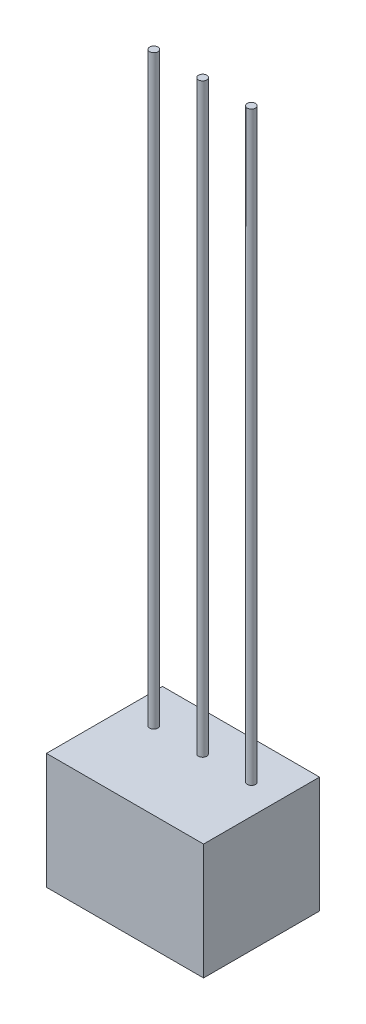
ISO-10303-21;
HEADER;
FILE_DESCRIPTION(('STEP AP214'),'2;1');
FILE_NAME('part.step','',(''),(''),'','','');
FILE_SCHEMA(('AUTOMOTIVE_DESIGN { 1 0 10303 214 1 1 1 1 }'));
ENDSEC;
DATA;
#1=APPLICATION_CONTEXT('core data for automotive mechanical design processes');
#2=APPLICATION_PROTOCOL_DEFINITION('international standard','automotive_design',2000,#1);
#3=PRODUCT_CONTEXT('',#1,'mechanical');
#4=PRODUCT('Part','Part','',(#3));
#5=PRODUCT_RELATED_PRODUCT_CATEGORY('part','',(#4));
#6=PRODUCT_DEFINITION_FORMATION('','',#4);
#7=PRODUCT_DEFINITION_CONTEXT('part definition',#1,'design');
#8=PRODUCT_DEFINITION('design','',#6,#7);
#9=PRODUCT_DEFINITION_SHAPE('','',#8);
#10=(LENGTH_UNIT() NAMED_UNIT(*) SI_UNIT(.MILLI.,.METRE.));
#11=(NAMED_UNIT(*) PLANE_ANGLE_UNIT() SI_UNIT($,.RADIAN.));
#12=(NAMED_UNIT(*) SI_UNIT($,.STERADIAN.) SOLID_ANGLE_UNIT());
#13=UNCERTAINTY_MEASURE_WITH_UNIT(LENGTH_MEASURE(1.E-05),#10,'distance_accuracy_value','');
#14=(GEOMETRIC_REPRESENTATION_CONTEXT(3) GLOBAL_UNCERTAINTY_ASSIGNED_CONTEXT((#13)) GLOBAL_UNIT_ASSIGNED_CONTEXT((#10,
#11,#12)) REPRESENTATION_CONTEXT('',''));
#15=CARTESIAN_POINT('',(0.,0.,0.));
#16=DIRECTION('',(0.,0.,1.));
#17=DIRECTION('',(1.,0.,0.));
#18=AXIS2_PLACEMENT_3D('',#15,#16,#17);
#19=CARTESIAN_POINT('',(0.,3.02,3.02));
#20=DIRECTION('',(0.,1.,0.));
#21=DIRECTION('',(0.,0.,1.));
#22=AXIS2_PLACEMENT_3D('',#19,#20,#21);
#23=PLANE('',#22);
#24=CARTESIAN_POINT('',(2.045,3.02,1.));
#25=DIRECTION('',(0.,1.,0.));
#26=DIRECTION('',(0.,0.,1.));
#27=AXIS2_PLACEMENT_3D('',#24,#25,#26);
#28=CIRCLE('',#27,0.107499999999999);
#29=CARTESIAN_POINT('',(2.045,3.02,1.1075));
#30=VERTEX_POINT('',#29);
#31=EDGE_CURVE('E155',#30,#30,#28,.T.);
#32=ORIENTED_EDGE('',*,*,#31,.F.);
#33=EDGE_LOOP('',(#32));
#34=FACE_BOUND('',#33,.T.);
#35=DIRECTION('',(1.,0.,0.));
#36=VECTOR('',#35,1.);
#37=CARTESIAN_POINT('',(0.,3.02,0.));
#38=LINE('',#37,#36);
#39=CARTESIAN_POINT('',(0.,3.02,0.));
#40=VERTEX_POINT('',#39);
#41=CARTESIAN_POINT('',(4.09,3.02,0.));
#42=VERTEX_POINT('',#41);
#43=EDGE_CURVE('E102',#40,#42,#38,.T.);
#44=ORIENTED_EDGE('',*,*,#43,.F.);
#45=DIRECTION('',(0.,0.,-1.));
#46=VECTOR('',#45,1.);
#47=CARTESIAN_POINT('',(0.,3.02,3.02));
#48=LINE('',#47,#46);
#49=CARTESIAN_POINT('',(0.,3.02,3.02));
#50=VERTEX_POINT('',#49);
#51=EDGE_CURVE('E36',#50,#40,#48,.T.);
#52=ORIENTED_EDGE('',*,*,#51,.F.);
#53=DIRECTION('',(1.,0.,0.));
#54=VECTOR('',#53,1.);
#55=CARTESIAN_POINT('',(0.,3.02,3.02));
#56=LINE('',#55,#54);
#57=CARTESIAN_POINT('',(4.09,3.02,3.02));
#58=VERTEX_POINT('',#57);
#59=EDGE_CURVE('E82',#50,#58,#56,.T.);
#60=ORIENTED_EDGE('',*,*,#59,.T.);
#61=DIRECTION('',(0.,0.,-1.));
#62=VECTOR('',#61,1.);
#63=CARTESIAN_POINT('',(4.09,3.02,3.02));
#64=LINE('',#63,#62);
#65=EDGE_CURVE('E87',#58,#42,#64,.T.);
#66=ORIENTED_EDGE('',*,*,#65,.T.);
#67=EDGE_LOOP('',(#44,#52,#60,#66));
#68=FACE_BOUND('',#67,.T.);
#69=CARTESIAN_POINT('',(0.774999999999998,3.02,1.));
#70=DIRECTION('',(0.,1.,0.));
#71=DIRECTION('',(0.,0.,1.));
#72=AXIS2_PLACEMENT_3D('',#69,#70,#71);
#73=CIRCLE('',#72,0.107499999999999);
#74=CARTESIAN_POINT('',(0.774999999999998,3.02,1.1075));
#75=VERTEX_POINT('',#74);
#76=EDGE_CURVE('E165',#75,#75,#73,.T.);
#77=ORIENTED_EDGE('',*,*,#76,.F.);
#78=EDGE_LOOP('',(#77));
#79=FACE_BOUND('',#78,.T.);
#80=CARTESIAN_POINT('',(3.315,3.02,1.));
#81=DIRECTION('',(0.,1.,0.));
#82=DIRECTION('',(0.,0.,1.));
#83=AXIS2_PLACEMENT_3D('',#80,#81,#82);
#84=CIRCLE('',#83,0.107499999999995);
#85=CARTESIAN_POINT('',(3.315,3.02,1.1075));
#86=VERTEX_POINT('',#85);
#87=EDGE_CURVE('E156',#86,#86,#84,.T.);
#88=ORIENTED_EDGE('',*,*,#87,.F.);
#89=EDGE_LOOP('',(#88));
#90=FACE_BOUND('',#89,.T.);
#91=ADVANCED_FACE('F32',(#34,#68,#79,#90),#23,.T.);
#92=CARTESIAN_POINT('',(0.,0.,3.02));
#93=DIRECTION('',(-1.,0.,0.));
#94=DIRECTION('',(0.,0.,1.));
#95=AXIS2_PLACEMENT_3D('',#92,#93,#94);
#96=PLANE('',#95);
#97=DIRECTION('',(0.,1.,0.));
#98=VECTOR('',#97,1.);
#99=CARTESIAN_POINT('',(0.,0.,0.));
#100=LINE('',#99,#98);
#101=CARTESIAN_POINT('',(0.,0.,0.));
#102=VERTEX_POINT('',#101);
#103=EDGE_CURVE('E99',#102,#40,#100,.T.);
#104=ORIENTED_EDGE('',*,*,#103,.F.);
#105=DIRECTION('',(0.,0.,-1.));
#106=VECTOR('',#105,1.);
#107=CARTESIAN_POINT('',(0.,0.,3.02));
#108=LINE('',#107,#106);
#109=CARTESIAN_POINT('',(0.,0.,3.02));
#110=VERTEX_POINT('',#109);
#111=EDGE_CURVE('E11',#110,#102,#108,.T.);
#112=ORIENTED_EDGE('',*,*,#111,.F.);
#113=DIRECTION('',(0.,1.,0.));
#114=VECTOR('',#113,1.);
#115=CARTESIAN_POINT('',(0.,0.,3.02));
#116=LINE('',#115,#114);
#117=EDGE_CURVE('E93',#110,#50,#116,.T.);
#118=ORIENTED_EDGE('',*,*,#117,.T.);
#119=ORIENTED_EDGE('',*,*,#51,.T.);
#120=EDGE_LOOP('',(#104,#112,#118,#119));
#121=FACE_BOUND('',#120,.T.);
#122=ADVANCED_FACE('F34',(#121),#96,.T.);
#123=CARTESIAN_POINT('',(0.,0.,3.02));
#124=DIRECTION('',(0.,1.,0.));
#125=DIRECTION('',(0.,0.,1.));
#126=AXIS2_PLACEMENT_3D('',#123,#124,#125);
#127=PLANE('',#126);
#128=DIRECTION('',(1.,0.,0.));
#129=VECTOR('',#128,1.);
#130=CARTESIAN_POINT('',(0.,0.,0.));
#131=LINE('',#130,#129);
#132=CARTESIAN_POINT('',(4.09,0.,0.));
#133=VERTEX_POINT('',#132);
#134=EDGE_CURVE('E66',#102,#133,#131,.T.);
#135=ORIENTED_EDGE('',*,*,#134,.T.);
#136=DIRECTION('',(0.,0.,-1.));
#137=VECTOR('',#136,1.);
#138=CARTESIAN_POINT('',(4.09,0.,3.02));
#139=LINE('',#138,#137);
#140=CARTESIAN_POINT('',(4.09,0.,3.02));
#141=VERTEX_POINT('',#140);
#142=EDGE_CURVE('E42',#141,#133,#139,.T.);
#143=ORIENTED_EDGE('',*,*,#142,.F.);
#144=DIRECTION('',(1.,0.,0.));
#145=VECTOR('',#144,1.);
#146=CARTESIAN_POINT('',(0.,0.,3.02));
#147=LINE('',#146,#145);
#148=EDGE_CURVE('E83',#110,#141,#147,.T.);
#149=ORIENTED_EDGE('',*,*,#148,.F.);
#150=ORIENTED_EDGE('',*,*,#111,.T.);
#151=EDGE_LOOP('',(#135,#143,#149,#150));
#152=FACE_BOUND('',#151,.T.);
#153=ADVANCED_FACE('F110',(#152),#127,.F.);
#154=CARTESIAN_POINT('',(4.09,0.,3.02));
#155=DIRECTION('',(-1.,0.,0.));
#156=DIRECTION('',(0.,0.,1.));
#157=AXIS2_PLACEMENT_3D('',#154,#155,#156);
#158=PLANE('',#157);
#159=DIRECTION('',(0.,1.,0.));
#160=VECTOR('',#159,1.);
#161=CARTESIAN_POINT('',(4.09,0.,0.));
#162=LINE('',#161,#160);
#163=EDGE_CURVE('E90',#133,#42,#162,.T.);
#164=ORIENTED_EDGE('',*,*,#163,.T.);
#165=ORIENTED_EDGE('',*,*,#65,.F.);
#166=DIRECTION('',(0.,1.,0.));
#167=VECTOR('',#166,1.);
#168=CARTESIAN_POINT('',(4.09,0.,3.02));
#169=LINE('',#168,#167);
#170=EDGE_CURVE('E78',#141,#58,#169,.T.);
#171=ORIENTED_EDGE('',*,*,#170,.F.);
#172=ORIENTED_EDGE('',*,*,#142,.T.);
#173=EDGE_LOOP('',(#164,#165,#171,#172));
#174=FACE_BOUND('',#173,.T.);
#175=ADVANCED_FACE('F88',(#174),#158,.F.);
#176=CARTESIAN_POINT('',(0.,0.,3.02));
#177=DIRECTION('',(0.,0.,-1.));
#178=DIRECTION('',(-1.,0.,0.));
#179=AXIS2_PLACEMENT_3D('',#176,#177,#178);
#180=PLANE('',#179);
#181=ORIENTED_EDGE('',*,*,#117,.F.);
#182=ORIENTED_EDGE('',*,*,#148,.T.);
#183=ORIENTED_EDGE('',*,*,#170,.T.);
#184=ORIENTED_EDGE('',*,*,#59,.F.);
#185=EDGE_LOOP('',(#181,#182,#183,#184));
#186=FACE_BOUND('',#185,.T.);
#187=ADVANCED_FACE('F81',(#186),#180,.F.);
#188=CARTESIAN_POINT('',(0.,0.,0.));
#189=DIRECTION('',(0.,0.,-1.));
#190=DIRECTION('',(-1.,0.,0.));
#191=AXIS2_PLACEMENT_3D('',#188,#189,#190);
#192=PLANE('',#191);
#193=ORIENTED_EDGE('',*,*,#103,.T.);
#194=ORIENTED_EDGE('',*,*,#43,.T.);
#195=ORIENTED_EDGE('',*,*,#163,.F.);
#196=ORIENTED_EDGE('',*,*,#134,.F.);
#197=EDGE_LOOP('',(#193,#194,#195,#196));
#198=FACE_BOUND('',#197,.T.);
#199=ADVANCED_FACE('F108',(#198),#192,.T.);
#200=CARTESIAN_POINT('',(0.774999999999998,18.27,1.));
#201=DIRECTION('',(0.,-1.,0.));
#202=DIRECTION('',(0.,0.,-1.));
#203=AXIS2_PLACEMENT_3D('',#200,#201,#202);
#204=CYLINDRICAL_SURFACE('',#203,0.107499999999999);
#205=CARTESIAN_POINT('',(0.774999999999998,18.27,1.));
#206=DIRECTION('',(0.,1.,0.));
#207=DIRECTION('',(0.,0.,1.));
#208=AXIS2_PLACEMENT_3D('',#205,#206,#207);
#209=CIRCLE('',#208,0.107499999999999);
#210=CARTESIAN_POINT('',(0.774999999999998,18.27,1.1075));
#211=VERTEX_POINT('',#210);
#212=EDGE_CURVE('E103',#211,#211,#209,.T.);
#213=ORIENTED_EDGE('',*,*,#212,.F.);
#214=EDGE_LOOP('',(#213));
#215=FACE_BOUND('',#214,.T.);
#216=ORIENTED_EDGE('',*,*,#76,.T.);
#217=EDGE_LOOP('',(#216));
#218=FACE_BOUND('',#217,.T.);
#219=ADVANCED_FACE('F125',(#215,#218),#204,.T.);
#220=CARTESIAN_POINT('',(0.774999999999998,18.27,1.));
#221=DIRECTION('',(0.,1.,0.));
#222=DIRECTION('',(0.,0.,1.));
#223=AXIS2_PLACEMENT_3D('',#220,#221,#222);
#224=PLANE('',#223);
#225=ORIENTED_EDGE('',*,*,#212,.T.);
#226=EDGE_LOOP('',(#225));
#227=FACE_BOUND('',#226,.T.);
#228=ADVANCED_FACE('F130',(#227),#224,.T.);
#229=CARTESIAN_POINT('',(2.045,18.27,1.));
#230=DIRECTION('',(0.,-1.,0.));
#231=DIRECTION('',(0.,0.,-1.));
#232=AXIS2_PLACEMENT_3D('',#229,#230,#231);
#233=CYLINDRICAL_SURFACE('',#232,0.107499999999999);
#234=CARTESIAN_POINT('',(2.045,18.27,1.));
#235=DIRECTION('',(0.,1.,0.));
#236=DIRECTION('',(0.,0.,1.));
#237=AXIS2_PLACEMENT_3D('',#234,#235,#236);
#238=CIRCLE('',#237,0.107499999999999);
#239=CARTESIAN_POINT('',(2.045,18.27,1.1075));
#240=VERTEX_POINT('',#239);
#241=EDGE_CURVE('E159',#240,#240,#238,.T.);
#242=ORIENTED_EDGE('',*,*,#241,.F.);
#243=EDGE_LOOP('',(#242));
#244=FACE_BOUND('',#243,.T.);
#245=ORIENTED_EDGE('',*,*,#31,.T.);
#246=EDGE_LOOP('',(#245));
#247=FACE_BOUND('',#246,.T.);
#248=ADVANCED_FACE('F134',(#244,#247),#233,.T.);
#249=CARTESIAN_POINT('',(2.045,18.27,1.));
#250=DIRECTION('',(0.,1.,0.));
#251=DIRECTION('',(0.,0.,1.));
#252=AXIS2_PLACEMENT_3D('',#249,#250,#251);
#253=PLANE('',#252);
#254=ORIENTED_EDGE('',*,*,#241,.T.);
#255=EDGE_LOOP('',(#254));
#256=FACE_BOUND('',#255,.T.);
#257=ADVANCED_FACE('F138',(#256),#253,.T.);
#258=CARTESIAN_POINT('',(3.315,18.27,1.));
#259=DIRECTION('',(0.,-1.,0.));
#260=DIRECTION('',(0.,0.,-1.));
#261=AXIS2_PLACEMENT_3D('',#258,#259,#260);
#262=CYLINDRICAL_SURFACE('',#261,0.107499999999995);
#263=CARTESIAN_POINT('',(3.315,18.27,1.));
#264=DIRECTION('',(0.,1.,0.));
#265=DIRECTION('',(0.,0.,1.));
#266=AXIS2_PLACEMENT_3D('',#263,#264,#265);
#267=CIRCLE('',#266,0.107499999999995);
#268=CARTESIAN_POINT('',(3.315,18.27,1.1075));
#269=VERTEX_POINT('',#268);
#270=EDGE_CURVE('E154',#269,#269,#267,.T.);
#271=ORIENTED_EDGE('',*,*,#270,.F.);
#272=EDGE_LOOP('',(#271));
#273=FACE_BOUND('',#272,.T.);
#274=ORIENTED_EDGE('',*,*,#87,.T.);
#275=EDGE_LOOP('',(#274));
#276=FACE_BOUND('',#275,.T.);
#277=ADVANCED_FACE('F142',(#273,#276),#262,.T.);
#278=CARTESIAN_POINT('',(3.315,18.27,1.));
#279=DIRECTION('',(0.,1.,0.));
#280=DIRECTION('',(0.,0.,1.));
#281=AXIS2_PLACEMENT_3D('',#278,#279,#280);
#282=PLANE('',#281);
#283=ORIENTED_EDGE('',*,*,#270,.T.);
#284=EDGE_LOOP('',(#283));
#285=FACE_BOUND('',#284,.T.);
#286=ADVANCED_FACE('F146',(#285),#282,.T.);
#287=CLOSED_SHELL('',(#91,#122,#153,#175,#187,#199,#219,#228,#248,#257,#277,#286));
#288=MANIFOLD_SOLID_BREP('B2',#287);
#289=ADVANCED_BREP_SHAPE_REPRESENTATION('',(#18,#288),#14);
#290=SHAPE_DEFINITION_REPRESENTATION(#9,#289);
ENDSEC;
END-ISO-10303-21;
